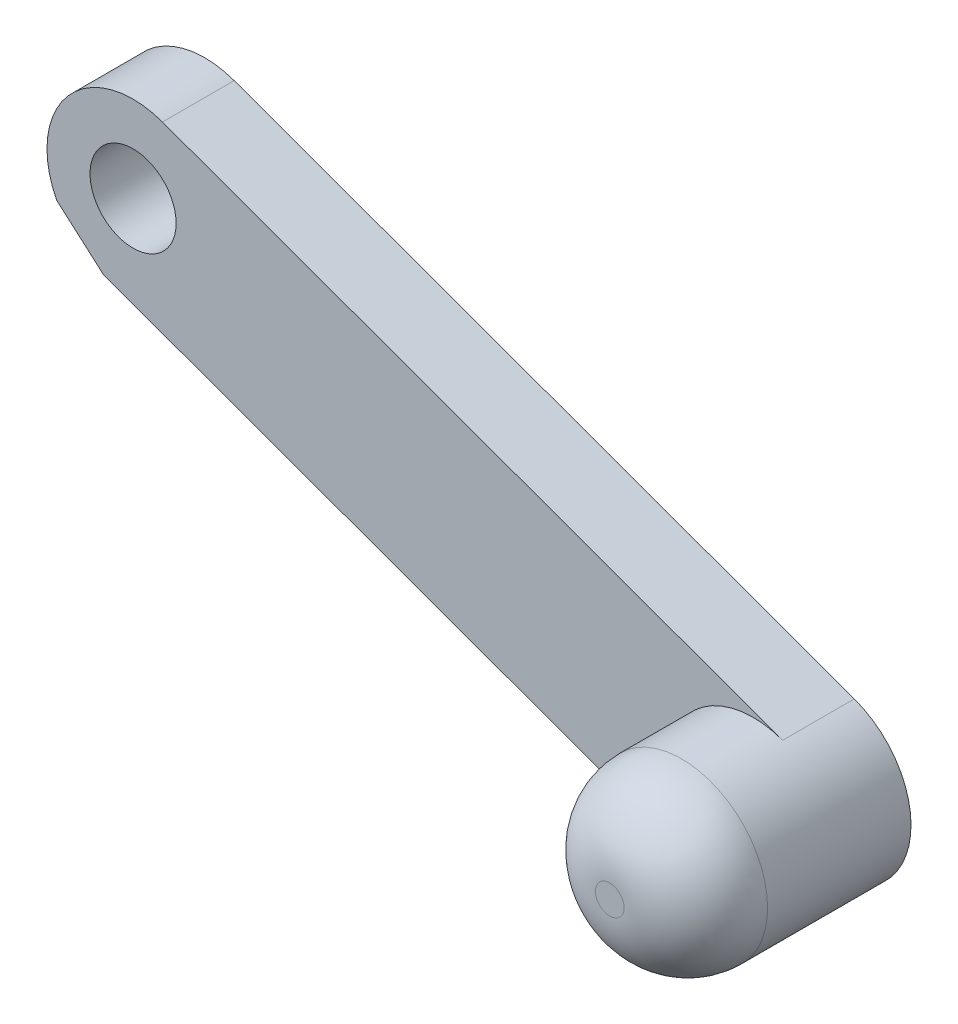
ISO-10303-21;
HEADER;
FILE_DESCRIPTION(('STEP AP214'),'2;1');
FILE_NAME('part.step','',(''),(''),'','','');
FILE_SCHEMA(('AUTOMOTIVE_DESIGN { 1 0 10303 214 1 1 1 1 }'));
ENDSEC;
DATA;
#1=APPLICATION_CONTEXT('core data for automotive mechanical design processes');
#2=APPLICATION_PROTOCOL_DEFINITION('international standard','automotive_design',2000,#1);
#3=PRODUCT_CONTEXT('',#1,'mechanical');
#4=PRODUCT('Part','Part','',(#3));
#5=PRODUCT_RELATED_PRODUCT_CATEGORY('part','',(#4));
#6=PRODUCT_DEFINITION_FORMATION('','',#4);
#7=PRODUCT_DEFINITION_CONTEXT('part definition',#1,'design');
#8=PRODUCT_DEFINITION('design','',#6,#7);
#9=PRODUCT_DEFINITION_SHAPE('','',#8);
#10=(LENGTH_UNIT() NAMED_UNIT(*) SI_UNIT(.MILLI.,.METRE.));
#11=(NAMED_UNIT(*) PLANE_ANGLE_UNIT() SI_UNIT($,.RADIAN.));
#12=(NAMED_UNIT(*) SI_UNIT($,.STERADIAN.) SOLID_ANGLE_UNIT());
#13=UNCERTAINTY_MEASURE_WITH_UNIT(LENGTH_MEASURE(1.E-05),#10,'distance_accuracy_value','');
#14=(GEOMETRIC_REPRESENTATION_CONTEXT(3) GLOBAL_UNCERTAINTY_ASSIGNED_CONTEXT((#13)) GLOBAL_UNIT_ASSIGNED_CONTEXT((#10,
#11,#12)) REPRESENTATION_CONTEXT('',''));
#15=CARTESIAN_POINT('',(0.,0.,0.));
#16=DIRECTION('',(0.,0.,1.));
#17=DIRECTION('',(1.,0.,0.));
#18=AXIS2_PLACEMENT_3D('',#15,#16,#17);
#19=CARTESIAN_POINT('',(6.49756378442091,17.8812321396723,-104.999999999994));
#20=DIRECTION('',(0.341524750490088,0.939872781179816,0.));
#21=DIRECTION('',(-0.939872781179816,0.341524750490088,0.));
#22=AXIS2_PLACEMENT_3D('',#19,#20,#21);
#23=PLANE('',#22);
#24=DIRECTION('',(0.939872781179816,-0.341524750490088,0.));
#25=VECTOR('',#24,1.);
#26=CARTESIAN_POINT('',(6.49756378442091,17.8812321396723,-107.499999999994));
#27=LINE('',#26,#25);
#28=CARTESIAN_POINT('',(154.076371742564,-35.7449783164497,-107.499999999994));
#29=VERTEX_POINT('',#28);
#30=CARTESIAN_POINT('',(175.6934457097,-43.6000475777217,-107.499999999994));
#31=VERTEX_POINT('',#30);
#32=EDGE_CURVE('E160',#29,#31,#27,.T.);
#33=ORIENTED_EDGE('',*,*,#32,.F.);
#34=DIRECTION('',(0.,0.,-1.));
#35=VECTOR('',#34,1.);
#36=CARTESIAN_POINT('',(154.076371742564,-35.7449783164497,-104.999999999994));
#37=LINE('',#36,#35);
#38=CARTESIAN_POINT('',(154.076371742564,-35.7449783164497,-104.999999999994));
#39=VERTEX_POINT('',#38);
#40=EDGE_CURVE('E88',#39,#29,#37,.T.);
#41=ORIENTED_EDGE('',*,*,#40,.F.);
#42=DIRECTION('',(0.939872781179816,-0.341524750490088,0.));
#43=VECTOR('',#42,1.);
#44=CARTESIAN_POINT('',(6.49756378442091,17.8812321396723,-104.999999999994));
#45=LINE('',#44,#43);
#46=CARTESIAN_POINT('',(175.6934457097,-43.6000475777216,-104.999999999994));
#47=VERTEX_POINT('',#46);
#48=EDGE_CURVE('E123',#39,#47,#45,.T.);
#49=ORIENTED_EDGE('',*,*,#48,.T.);
#50=DIRECTION('',(0.,0.,-1.));
#51=VECTOR('',#50,1.);
#52=CARTESIAN_POINT('',(175.6934457097,-43.6000475777217,-104.999999999994));
#53=LINE('',#52,#51);
#54=EDGE_CURVE('E83',#47,#31,#53,.T.);
#55=ORIENTED_EDGE('',*,*,#54,.T.);
#56=EDGE_LOOP('',(#33,#41,#49,#55));
#57=FACE_BOUND('',#56,.T.);
#58=ADVANCED_FACE('F35',(#57),#23,.T.);
#59=CARTESIAN_POINT('',(153.051797491094,-38.5645966599891,-104.999999999994));
#60=DIRECTION('',(0.,0.,-1.));
#61=DIRECTION('',(-1.,0.,0.));
#62=AXIS2_PLACEMENT_3D('',#59,#60,#61);
#63=CYLINDRICAL_SURFACE('',#62,2.99999999999999);
#64=CARTESIAN_POINT('',(153.051797491094,-38.5645966599891,-107.499999999994));
#65=DIRECTION('',(0.,0.,1.));
#66=DIRECTION('',(1.,0.,0.));
#67=AXIS2_PLACEMENT_3D('',#64,#65,#66);
#68=CIRCLE('',#67,2.99999999999999);
#69=CARTESIAN_POINT('',(150.392873292927,-39.9538850060153,-107.499999999994));
#70=VERTEX_POINT('',#69);
#71=EDGE_CURVE('E158',#29,#70,#68,.T.);
#72=ORIENTED_EDGE('',*,*,#71,.T.);
#73=DIRECTION('',(0.,0.,-1.));
#74=VECTOR('',#73,1.);
#75=CARTESIAN_POINT('',(150.392873292927,-39.9538850060153,-104.999999999994));
#76=LINE('',#75,#74);
#77=CARTESIAN_POINT('',(150.392873292927,-39.9538850060153,-104.999999999994));
#78=VERTEX_POINT('',#77);
#79=EDGE_CURVE('E115',#78,#70,#76,.T.);
#80=ORIENTED_EDGE('',*,*,#79,.F.);
#81=CARTESIAN_POINT('',(153.051797491094,-38.5645966599891,-104.999999999994));
#82=DIRECTION('',(0.,0.,1.));
#83=DIRECTION('',(1.,0.,0.));
#84=AXIS2_PLACEMENT_3D('',#81,#82,#83);
#85=CIRCLE('',#84,2.99999999999999);
#86=EDGE_CURVE('E103',#39,#78,#85,.T.);
#87=ORIENTED_EDGE('',*,*,#86,.F.);
#88=ORIENTED_EDGE('',*,*,#40,.T.);
#89=EDGE_LOOP('',(#72,#80,#87,#88));
#90=FACE_BOUND('',#89,.T.);
#91=ADVANCED_FACE('F178',(#90),#63,.T.);
#92=CARTESIAN_POINT('',(45.5852038173336,51.9727427390637,-104.999999999994));
#93=DIRECTION('',(0.65939758562101,0.751794402797189,0.));
#94=DIRECTION('',(-0.751794402797189,0.65939758562101,0.));
#95=AXIS2_PLACEMENT_3D('',#92,#93,#94);
#96=PLANE('',#95);
#97=DIRECTION('',(0.751794402797189,-0.65939758562101,0.));
#98=VECTOR('',#97,1.);
#99=CARTESIAN_POINT('',(45.5852038173336,51.9727427390637,-107.499999999994));
#100=LINE('',#99,#98);
#101=CARTESIAN_POINT('',(152.021065929059,-41.3819699840315,-107.499999999994));
#102=VERTEX_POINT('',#101);
#103=EDGE_CURVE('E112',#70,#102,#100,.T.);
#104=ORIENTED_EDGE('',*,*,#103,.T.);
#105=DIRECTION('',(0.,0.,-1.));
#106=VECTOR('',#105,1.);
#107=CARTESIAN_POINT('',(152.021065929059,-41.3819699840315,-104.999999999994));
#108=LINE('',#107,#106);
#109=CARTESIAN_POINT('',(152.021065929059,-41.3819699840315,-104.999999999994));
#110=VERTEX_POINT('',#109);
#111=EDGE_CURVE('E109',#110,#102,#108,.T.);
#112=ORIENTED_EDGE('',*,*,#111,.F.);
#113=DIRECTION('',(0.751794402797189,-0.65939758562101,0.));
#114=VECTOR('',#113,1.);
#115=CARTESIAN_POINT('',(45.5852038173336,51.9727427390637,-104.999999999994));
#116=LINE('',#115,#114);
#117=EDGE_CURVE('E95',#78,#110,#116,.T.);
#118=ORIENTED_EDGE('',*,*,#117,.F.);
#119=ORIENTED_EDGE('',*,*,#79,.T.);
#120=EDGE_LOOP('',(#104,#112,#118,#119));
#121=FACE_BOUND('',#120,.T.);
#122=ADVANCED_FACE('F110',(#121),#96,.F.);
#123=CARTESIAN_POINT('',(152.027223239623,-41.3842150035285,-107.499999999994));
#124=VERTEX_POINT('',#123);
#125=EDGE_CURVE('E156',#102,#124,#68,.T.);
#126=ORIENTED_EDGE('',*,*,#125,.T.);
#127=DIRECTION('',(0.,0.,-1.));
#128=VECTOR('',#127,1.);
#129=CARTESIAN_POINT('',(152.027223239623,-41.3842150035285,-104.999999999994));
#130=LINE('',#129,#128);
#131=CARTESIAN_POINT('',(152.027223239623,-41.3842150035285,-104.999999999994));
#132=VERTEX_POINT('',#131);
#133=EDGE_CURVE('E116',#132,#124,#130,.T.);
#134=ORIENTED_EDGE('',*,*,#133,.F.);
#135=EDGE_CURVE('E100',#110,#132,#85,.T.);
#136=ORIENTED_EDGE('',*,*,#135,.F.);
#137=ORIENTED_EDGE('',*,*,#111,.T.);
#138=EDGE_LOOP('',(#126,#134,#136,#137));
#139=FACE_BOUND('',#138,.T.);
#140=ADVANCED_FACE('F118',(#139),#63,.T.);
#141=CARTESIAN_POINT('',(4.44841528148038,12.2419954525934,-104.999999999994));
#142=DIRECTION('',(0.341524750490088,0.939872781179816,0.));
#143=DIRECTION('',(-0.939872781179816,0.341524750490088,0.));
#144=AXIS2_PLACEMENT_3D('',#141,#142,#143);
#145=PLANE('',#144);
#146=DIRECTION('',(0.939872781179816,-0.341524750490088,0.));
#147=VECTOR('',#146,1.);
#148=CARTESIAN_POINT('',(4.44841528148038,12.2419954525934,-107.499999999994));
#149=LINE('',#148,#147);
#150=CARTESIAN_POINT('',(173.644297206759,-49.2392842648006,-107.499999999994));
#151=VERTEX_POINT('',#150);
#152=EDGE_CURVE('E75',#124,#151,#149,.T.);
#153=ORIENTED_EDGE('',*,*,#152,.T.);
#154=DIRECTION('',(0.,0.,-1.));
#155=VECTOR('',#154,1.);
#156=CARTESIAN_POINT('',(173.644297206759,-49.2392842648006,-104.999999999994));
#157=LINE('',#156,#155);
#158=CARTESIAN_POINT('',(173.644297206759,-49.2392842648006,-104.999999999994));
#159=VERTEX_POINT('',#158);
#160=EDGE_CURVE('E136',#159,#151,#157,.T.);
#161=ORIENTED_EDGE('',*,*,#160,.F.);
#162=DIRECTION('',(0.939872781179816,-0.341524750490088,0.));
#163=VECTOR('',#162,1.);
#164=CARTESIAN_POINT('',(4.44841528148038,12.2419954525934,-104.999999999994));
#165=LINE('',#164,#163);
#166=EDGE_CURVE('E52',#132,#159,#165,.T.);
#167=ORIENTED_EDGE('',*,*,#166,.F.);
#168=ORIENTED_EDGE('',*,*,#133,.T.);
#169=EDGE_LOOP('',(#153,#161,#167,#168));
#170=FACE_BOUND('',#169,.T.);
#171=ADVANCED_FACE('F187',(#170),#145,.F.);
#172=CARTESIAN_POINT('',(174.668871458229,-46.4196659212611,-104.999999999994));
#173=DIRECTION('',(0.,0.,-1.));
#174=DIRECTION('',(-1.,0.,0.));
#175=AXIS2_PLACEMENT_3D('',#172,#173,#174);
#176=CYLINDRICAL_SURFACE('',#175,0.901496021216368);
#177=CARTESIAN_POINT('',(174.668871458229,-46.4196659212611,-104.999999999994));
#178=DIRECTION('',(0.,0.,1.));
#179=DIRECTION('',(1.,0.,0.));
#180=AXIS2_PLACEMENT_3D('',#177,#178,#179);
#181=CIRCLE('',#180,0.901496021216368);
#182=CARTESIAN_POINT('',(175.570367479446,-46.4196659212611,-104.999999999994));
#183=VERTEX_POINT('',#182);
#184=EDGE_CURVE('E163',#183,#183,#181,.T.);
#185=ORIENTED_EDGE('',*,*,#184,.T.);
#186=EDGE_LOOP('',(#185));
#187=FACE_BOUND('',#186,.T.);
#188=CARTESIAN_POINT('',(174.668871458229,-46.4196659212611,-107.499999999994));
#189=DIRECTION('',(0.,0.,1.));
#190=DIRECTION('',(1.,0.,0.));
#191=AXIS2_PLACEMENT_3D('',#188,#189,#190);
#192=CIRCLE('',#191,0.901496021216368);
#193=CARTESIAN_POINT('',(175.570367479446,-46.4196659212611,-107.499999999994));
#194=VERTEX_POINT('',#193);
#195=EDGE_CURVE('E127',#194,#194,#192,.T.);
#196=ORIENTED_EDGE('',*,*,#195,.F.);
#197=EDGE_LOOP('',(#196));
#198=FACE_BOUND('',#197,.T.);
#199=ADVANCED_FACE('F190',(#187,#198),#176,.F.);
#200=CARTESIAN_POINT('',(174.668871458229,-46.4196659212611,-104.999999999994));
#201=DIRECTION('',(0.,0.,-1.));
#202=DIRECTION('',(-1.,0.,0.));
#203=AXIS2_PLACEMENT_3D('',#200,#201,#202);
#204=CYLINDRICAL_SURFACE('',#203,2.99999999999999);
#205=CARTESIAN_POINT('',(174.668871458229,-46.4196659212611,-102.499999999994));
#206=DIRECTION('',(0.,0.,1.));
#207=DIRECTION('',(1.,0.,0.));
#208=AXIS2_PLACEMENT_3D('',#205,#206,#207);
#209=CIRCLE('',#208,2.99999999999999);
#210=CARTESIAN_POINT('',(177.668871458229,-46.4196659212611,-102.499999999994));
#211=VERTEX_POINT('',#210);
#212=EDGE_CURVE('E11',#211,#211,#209,.F.);
#213=ORIENTED_EDGE('',*,*,#212,.T.);
#214=EDGE_LOOP('',(#213));
#215=FACE_BOUND('',#214,.T.);
#216=CARTESIAN_POINT('',(174.668871458229,-46.4196659212611,-107.499999999994));
#217=DIRECTION('',(0.,0.,1.));
#218=DIRECTION('',(1.,0.,0.));
#219=AXIS2_PLACEMENT_3D('',#216,#217,#218);
#220=CIRCLE('',#219,2.99999999999999);
#221=EDGE_CURVE('E153',#151,#31,#220,.T.);
#222=ORIENTED_EDGE('',*,*,#221,.T.);
#223=ORIENTED_EDGE('',*,*,#54,.F.);
#224=CARTESIAN_POINT('',(174.66887145823,-46.419665921261,-104.999999999994));
#225=DIRECTION('',(0.,0.,1.));
#226=DIRECTION('',(1.,0.,0.));
#227=AXIS2_PLACEMENT_3D('',#224,#225,#226);
#228=CIRCLE('',#227,2.99999999999999);
#229=EDGE_CURVE('E167',#47,#159,#228,.T.);
#230=ORIENTED_EDGE('',*,*,#229,.T.);
#231=ORIENTED_EDGE('',*,*,#160,.T.);
#232=EDGE_LOOP('',(#222,#223,#230,#231));
#233=FACE_BOUND('',#232,.T.);
#234=ADVANCED_FACE('F172',(#215,#233),#204,.T.);
#235=CARTESIAN_POINT('',(153.051797491517,-38.5645966594871,-104.999999999994));
#236=DIRECTION('',(0.,0.,-1.));
#237=DIRECTION('',(-1.,0.,0.));
#238=AXIS2_PLACEMENT_3D('',#235,#236,#237);
#239=CYLINDRICAL_SURFACE('',#238,1.5);
#240=CARTESIAN_POINT('',(153.051797491517,-38.5645966594871,-104.999999999994));
#241=DIRECTION('',(0.,0.,1.));
#242=DIRECTION('',(1.,0.,0.));
#243=AXIS2_PLACEMENT_3D('',#240,#241,#242);
#244=CIRCLE('',#243,1.5);
#245=CARTESIAN_POINT('',(154.551797491517,-38.5645966594871,-104.999999999994));
#246=VERTEX_POINT('',#245);
#247=EDGE_CURVE('E120',#246,#246,#244,.F.);
#248=ORIENTED_EDGE('',*,*,#247,.F.);
#249=EDGE_LOOP('',(#248));
#250=FACE_BOUND('',#249,.T.);
#251=CARTESIAN_POINT('',(153.051797491517,-38.5645966594871,-107.499999999994));
#252=DIRECTION('',(0.,0.,1.));
#253=DIRECTION('',(1.,0.,0.));
#254=AXIS2_PLACEMENT_3D('',#251,#252,#253);
#255=CIRCLE('',#254,1.5);
#256=CARTESIAN_POINT('',(154.551797491517,-38.5645966594871,-107.499999999994));
#257=VERTEX_POINT('',#256);
#258=EDGE_CURVE('E124',#257,#257,#255,.F.);
#259=ORIENTED_EDGE('',*,*,#258,.T.);
#260=EDGE_LOOP('',(#259));
#261=FACE_BOUND('',#260,.T.);
#262=ADVANCED_FACE('F193',(#250,#261),#239,.F.);
#263=CARTESIAN_POINT('',(0.,0.,-104.999999999994));
#264=DIRECTION('',(0.,0.,1.));
#265=DIRECTION('',(1.,0.,0.));
#266=AXIS2_PLACEMENT_3D('',#263,#264,#265);
#267=PLANE('',#266);
#268=ORIENTED_EDGE('',*,*,#229,.F.);
#269=ORIENTED_EDGE('',*,*,#48,.F.);
#270=ORIENTED_EDGE('',*,*,#86,.T.);
#271=ORIENTED_EDGE('',*,*,#117,.T.);
#272=ORIENTED_EDGE('',*,*,#135,.T.);
#273=ORIENTED_EDGE('',*,*,#166,.T.);
#274=EDGE_LOOP('',(#268,#269,#270,#271,#272,#273));
#275=FACE_BOUND('',#274,.T.);
#276=ORIENTED_EDGE('',*,*,#247,.T.);
#277=EDGE_LOOP('',(#276));
#278=FACE_BOUND('',#277,.T.);
#279=ADVANCED_FACE('F97',(#275,#278),#267,.T.);
#280=CARTESIAN_POINT('',(0.,0.,-107.499999999994));
#281=DIRECTION('',(0.,0.,1.));
#282=DIRECTION('',(1.,0.,0.));
#283=AXIS2_PLACEMENT_3D('',#280,#281,#282);
#284=PLANE('',#283);
#285=ORIENTED_EDGE('',*,*,#32,.T.);
#286=ORIENTED_EDGE('',*,*,#221,.F.);
#287=ORIENTED_EDGE('',*,*,#152,.F.);
#288=ORIENTED_EDGE('',*,*,#125,.F.);
#289=ORIENTED_EDGE('',*,*,#103,.F.);
#290=ORIENTED_EDGE('',*,*,#71,.F.);
#291=EDGE_LOOP('',(#285,#286,#287,#288,#289,#290));
#292=FACE_BOUND('',#291,.T.);
#293=ORIENTED_EDGE('',*,*,#195,.T.);
#294=EDGE_LOOP('',(#293));
#295=FACE_BOUND('',#294,.T.);
#296=ORIENTED_EDGE('',*,*,#258,.F.);
#297=EDGE_LOOP('',(#296));
#298=FACE_BOUND('',#297,.T.);
#299=ADVANCED_FACE('F175',(#292,#295,#298),#284,.F.);
#300=CARTESIAN_POINT('',(174.66887145823,-46.419665921261,-99.9999999999937));
#301=DIRECTION('',(0.,0.,1.));
#302=DIRECTION('',(1.,0.,0.));
#303=AXIS2_PLACEMENT_3D('',#300,#301,#302);
#304=PLANE('',#303);
#305=CARTESIAN_POINT('',(174.668871458229,-46.4196659212611,-99.9999999999937));
#306=DIRECTION('',(0.,0.,1.));
#307=DIRECTION('',(1.,0.,0.));
#308=AXIS2_PLACEMENT_3D('',#305,#306,#307);
#309=CIRCLE('',#308,0.499999999999995);
#310=CARTESIAN_POINT('',(175.168871458229,-46.4196659212611,-99.9999999999937));
#311=VERTEX_POINT('',#310);
#312=EDGE_CURVE('E44',#311,#311,#309,.T.);
#313=ORIENTED_EDGE('',*,*,#312,.T.);
#314=EDGE_LOOP('',(#313));
#315=FACE_BOUND('',#314,.T.);
#316=ADVANCED_FACE('F202',(#315),#304,.T.);
#317=CARTESIAN_POINT('',(174.66887145823,-46.419665921261,-104.999999999994));
#318=DIRECTION('',(0.,0.,1.));
#319=DIRECTION('',(1.,0.,0.));
#320=AXIS2_PLACEMENT_3D('',#317,#318,#319);
#321=PLANE('',#320);
#322=ORIENTED_EDGE('',*,*,#184,.F.);
#323=EDGE_LOOP('',(#322));
#324=FACE_BOUND('',#323,.T.);
#325=ADVANCED_FACE('F205',(#324),#321,.F.);
#326=CARTESIAN_POINT('',(174.668871458229,-46.4196659212611,-102.499999999994));
#327=DIRECTION('',(0.,0.,1.));
#328=DIRECTION('',(1.,0.,0.));
#329=AXIS2_PLACEMENT_3D('',#326,#327,#328);
#330=DEGENERATE_TOROIDAL_SURFACE('',#329,0.499999999999995,2.5,.T.);
#331=ORIENTED_EDGE('',*,*,#212,.F.);
#332=EDGE_LOOP('',(#331));
#333=FACE_BOUND('',#332,.T.);
#334=ORIENTED_EDGE('',*,*,#312,.F.);
#335=EDGE_LOOP('',(#334));
#336=FACE_BOUND('',#335,.T.);
#337=ADVANCED_FACE('F37',(#333,#336),#330,.T.);
#338=CLOSED_SHELL('',(#58,#91,#122,#140,#171,#199,#234,#262,#279,#299,#316,#325,#337));
#339=MANIFOLD_SOLID_BREP('B2',#338);
#340=ADVANCED_BREP_SHAPE_REPRESENTATION('',(#18,#339),#14);
#341=SHAPE_DEFINITION_REPRESENTATION(#9,#340);
ENDSEC;
END-ISO-10303-21;
